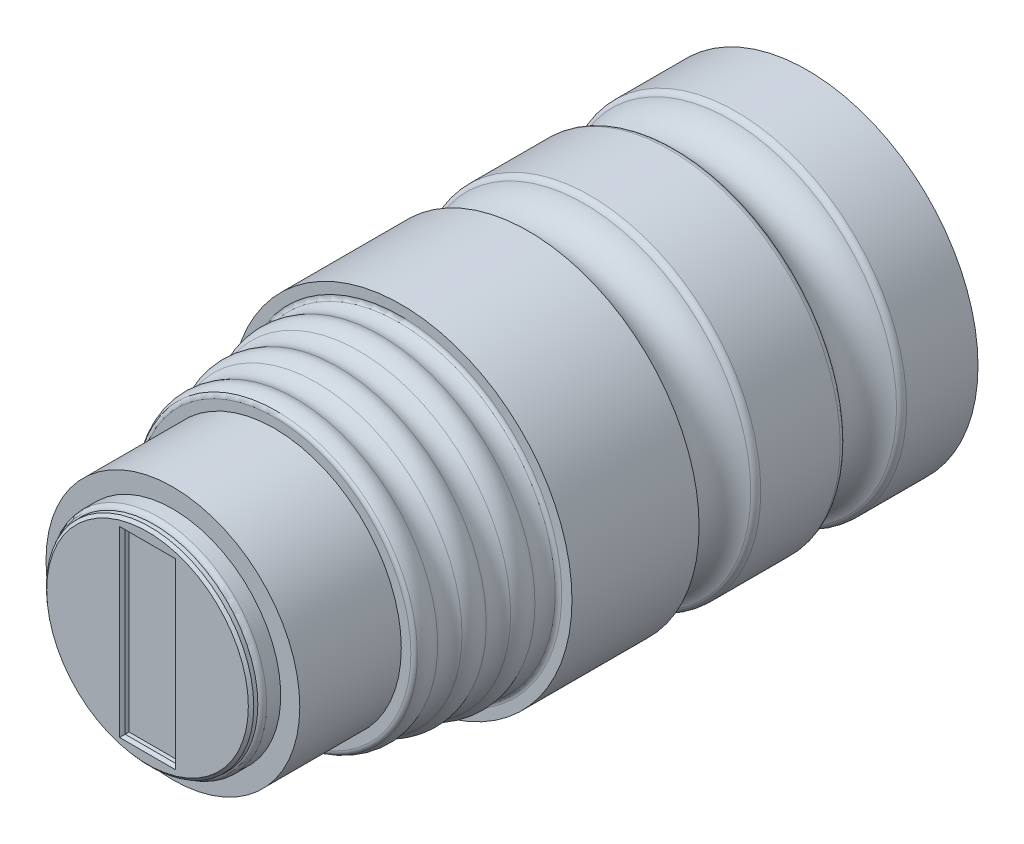
ISO-10303-21;
HEADER;
FILE_DESCRIPTION(('STEP AP214'),'2;1');
FILE_NAME('part.step','',(''),(''),'','','');
FILE_SCHEMA(('AUTOMOTIVE_DESIGN { 1 0 10303 214 1 1 1 1 }'));
ENDSEC;
DATA;
#1=APPLICATION_CONTEXT('core data for automotive mechanical design processes');
#2=APPLICATION_PROTOCOL_DEFINITION('international standard','automotive_design',2000,#1);
#3=PRODUCT_CONTEXT('',#1,'mechanical');
#4=PRODUCT('Part','Part','',(#3));
#5=PRODUCT_RELATED_PRODUCT_CATEGORY('part','',(#4));
#6=PRODUCT_DEFINITION_FORMATION('','',#4);
#7=PRODUCT_DEFINITION_CONTEXT('part definition',#1,'design');
#8=PRODUCT_DEFINITION('design','',#6,#7);
#9=PRODUCT_DEFINITION_SHAPE('','',#8);
#10=(LENGTH_UNIT() NAMED_UNIT(*) SI_UNIT(.MILLI.,.METRE.));
#11=(NAMED_UNIT(*) PLANE_ANGLE_UNIT() SI_UNIT($,.RADIAN.));
#12=(NAMED_UNIT(*) SI_UNIT($,.STERADIAN.) SOLID_ANGLE_UNIT());
#13=UNCERTAINTY_MEASURE_WITH_UNIT(LENGTH_MEASURE(1.E-05),#10,'distance_accuracy_value','');
#14=(GEOMETRIC_REPRESENTATION_CONTEXT(3) GLOBAL_UNCERTAINTY_ASSIGNED_CONTEXT((#13)) GLOBAL_UNIT_ASSIGNED_CONTEXT((#10,
#11,#12)) REPRESENTATION_CONTEXT('',''));
#15=CARTESIAN_POINT('',(0.,0.,0.));
#16=DIRECTION('',(0.,0.,1.));
#17=DIRECTION('',(1.,0.,0.));
#18=AXIS2_PLACEMENT_3D('',#15,#16,#17);
#19=CARTESIAN_POINT('',(10.95,0.,4.));
#20=DIRECTION('',(0.,0.,-1.));
#21=DIRECTION('',(-1.,0.,0.));
#22=AXIS2_PLACEMENT_3D('',#19,#20,#21);
#23=PLANE('',#22);
#24=CARTESIAN_POINT('',(0.,0.,4.));
#25=DIRECTION('',(0.,0.,-1.));
#26=DIRECTION('',(-1.,0.,0.));
#27=AXIS2_PLACEMENT_3D('',#24,#25,#26);
#28=CIRCLE('',#27,10.7534342209073);
#29=CARTESIAN_POINT('',(-10.7534342209073,0.,4.));
#30=VERTEX_POINT('',#29);
#31=EDGE_CURVE('E11',#30,#30,#28,.F.);
#32=ORIENTED_EDGE('',*,*,#31,.T.);
#33=EDGE_LOOP('',(#32));
#34=FACE_BOUND('',#33,.T.);
#35=CARTESIAN_POINT('',(0.,0.,4.));
#36=DIRECTION('',(0.,0.,-1.));
#37=DIRECTION('',(-1.,0.,0.));
#38=AXIS2_PLACEMENT_3D('',#35,#36,#37);
#39=CIRCLE('',#38,10.);
#40=CARTESIAN_POINT('',(-10.,0.,4.));
#41=VERTEX_POINT('',#40);
#42=EDGE_CURVE('E116',#41,#41,#39,.T.);
#43=ORIENTED_EDGE('',*,*,#42,.T.);
#44=EDGE_LOOP('',(#43));
#45=FACE_BOUND('',#44,.T.);
#46=ADVANCED_FACE('F39',(#34,#45),#23,.F.);
#47=CARTESIAN_POINT('',(0.,0.,2.97454517728132));
#48=DIRECTION('',(0.,0.,-1.));
#49=DIRECTION('',(-1.,0.,0.));
#50=AXIS2_PLACEMENT_3D('',#47,#48,#49);
#51=TOROIDAL_SURFACE('',#50,9.79419007076437,1.54513888888884);
#52=CARTESIAN_POINT('',(0.,0.,3.81847300053728));
#53=DIRECTION('',(0.,0.,-1.));
#54=DIRECTION('',(-1.,0.,0.));
#55=AXIS2_PLACEMENT_3D('',#52,#53,#54);
#56=CIRCLE('',#55,11.0885007039167);
#57=CARTESIAN_POINT('',(-11.0885007039167,0.,3.81847300053728));
#58=VERTEX_POINT('',#57);
#59=EDGE_CURVE('E47',#58,#58,#56,.T.);
#60=ORIENTED_EDGE('',*,*,#59,.T.);
#61=EDGE_LOOP('',(#60));
#62=FACE_BOUND('',#61,.T.);
#63=CARTESIAN_POINT('',(0.,0.,2.33333333333333));
#64=DIRECTION('',(0.,0.,-1.));
#65=DIRECTION('',(-1.,0.,0.));
#66=AXIS2_PLACEMENT_3D('',#63,#64,#65);
#67=CIRCLE('',#66,11.2);
#68=CARTESIAN_POINT('',(-11.2,0.,2.33333333333333));
#69=VERTEX_POINT('',#68);
#70=EDGE_CURVE('E270',#69,#69,#67,.T.);
#71=ORIENTED_EDGE('',*,*,#70,.F.);
#72=EDGE_LOOP('',(#71));
#73=FACE_BOUND('',#72,.T.);
#74=ADVANCED_FACE('F156',(#62,#73),#51,.T.);
#75=CARTESIAN_POINT('',(0.,0.,1.69212148938536));
#76=DIRECTION('',(0.,0.,-1.));
#77=DIRECTION('',(-1.,0.,0.));
#78=AXIS2_PLACEMENT_3D('',#75,#76,#77);
#79=TOROIDAL_SURFACE('',#78,12.6058099292357,1.54513888888891);
#80=CARTESIAN_POINT('',(0.,0.,0.66666666666667));
#81=DIRECTION('',(0.,0.,-1.));
#82=DIRECTION('',(-1.,0.,0.));
#83=AXIS2_PLACEMENT_3D('',#80,#81,#82);
#84=CIRCLE('',#83,11.45);
#85=CARTESIAN_POINT('',(-11.45,0.,0.666666666666671));
#86=VERTEX_POINT('',#85);
#87=EDGE_CURVE('E273',#86,#86,#84,.T.);
#88=ORIENTED_EDGE('',*,*,#87,.F.);
#89=EDGE_LOOP('',(#88));
#90=FACE_BOUND('',#89,.T.);
#91=ORIENTED_EDGE('',*,*,#70,.T.);
#92=EDGE_LOOP('',(#91));
#93=FACE_BOUND('',#92,.T.);
#94=ADVANCED_FACE('F174',(#90,#93),#79,.F.);
#95=CARTESIAN_POINT('',(0.,0.,-0.358788156052017));
#96=DIRECTION('',(0.,0.,-1.));
#97=DIRECTION('',(-1.,0.,0.));
#98=AXIS2_PLACEMENT_3D('',#95,#96,#97);
#99=TOROIDAL_SURFACE('',#98,10.2941900707643,1.54513888888888);
#100=CARTESIAN_POINT('',(0.,0.,-1.));
#101=DIRECTION('',(0.,0.,-1.));
#102=DIRECTION('',(-1.,0.,0.));
#103=AXIS2_PLACEMENT_3D('',#100,#101,#102);
#104=CIRCLE('',#103,11.7);
#105=CARTESIAN_POINT('',(-11.7,0.,-0.999999999999999));
#106=VERTEX_POINT('',#105);
#107=EDGE_CURVE('E331',#106,#106,#104,.T.);
#108=ORIENTED_EDGE('',*,*,#107,.F.);
#109=EDGE_LOOP('',(#108));
#110=FACE_BOUND('',#109,.T.);
#111=ORIENTED_EDGE('',*,*,#87,.T.);
#112=EDGE_LOOP('',(#111));
#113=FACE_BOUND('',#112,.T.);
#114=ADVANCED_FACE('F391',(#110,#113),#99,.T.);
#115=CARTESIAN_POINT('',(0.,0.,-1.64121184394798));
#116=DIRECTION('',(0.,0.,-1.));
#117=DIRECTION('',(-1.,0.,0.));
#118=AXIS2_PLACEMENT_3D('',#115,#116,#117);
#119=TOROIDAL_SURFACE('',#118,13.1058099292357,1.54513888888889);
#120=CARTESIAN_POINT('',(0.,0.,-2.66666666666667));
#121=DIRECTION('',(0.,0.,-1.));
#122=DIRECTION('',(-1.,0.,0.));
#123=AXIS2_PLACEMENT_3D('',#120,#121,#122);
#124=CIRCLE('',#123,11.95);
#125=CARTESIAN_POINT('',(-11.95,0.,-2.66666666666667));
#126=VERTEX_POINT('',#125);
#127=EDGE_CURVE('E334',#126,#126,#124,.T.);
#128=ORIENTED_EDGE('',*,*,#127,.F.);
#129=EDGE_LOOP('',(#128));
#130=FACE_BOUND('',#129,.T.);
#131=ORIENTED_EDGE('',*,*,#107,.T.);
#132=EDGE_LOOP('',(#131));
#133=FACE_BOUND('',#132,.T.);
#134=ADVANCED_FACE('F387',(#130,#133),#119,.F.);
#135=CARTESIAN_POINT('',(0.,0.,-3.69212148938535));
#136=DIRECTION('',(0.,0.,-1.));
#137=DIRECTION('',(-1.,0.,0.));
#138=AXIS2_PLACEMENT_3D('',#135,#136,#137);
#139=TOROIDAL_SURFACE('',#138,10.7941900707643,1.54513888888888);
#140=CARTESIAN_POINT('',(0.,0.,-4.33333333333333));
#141=DIRECTION('',(0.,0.,-1.));
#142=DIRECTION('',(-1.,0.,0.));
#143=AXIS2_PLACEMENT_3D('',#140,#141,#142);
#144=CIRCLE('',#143,12.2);
#145=CARTESIAN_POINT('',(-12.2,0.,-4.33333333333333));
#146=VERTEX_POINT('',#145);
#147=EDGE_CURVE('E337',#146,#146,#144,.T.);
#148=ORIENTED_EDGE('',*,*,#147,.F.);
#149=EDGE_LOOP('',(#148));
#150=FACE_BOUND('',#149,.T.);
#151=ORIENTED_EDGE('',*,*,#127,.T.);
#152=EDGE_LOOP('',(#151));
#153=FACE_BOUND('',#152,.T.);
#154=ADVANCED_FACE('F383',(#150,#153),#139,.T.);
#155=CARTESIAN_POINT('',(0.,0.,-4.97454517728132));
#156=DIRECTION('',(0.,0.,-1.));
#157=DIRECTION('',(-1.,0.,0.));
#158=AXIS2_PLACEMENT_3D('',#155,#156,#157);
#159=TOROIDAL_SURFACE('',#158,13.6058099292357,1.54513888888889);
#160=CARTESIAN_POINT('',(0.,0.,-5.81847300053727));
#161=DIRECTION('',(0.,0.,1.));
#162=DIRECTION('',(1.,0.,0.));
#163=AXIS2_PLACEMENT_3D('',#160,#161,#162);
#164=CIRCLE('',#163,12.3114992960833);
#165=CARTESIAN_POINT('',(12.3114992960833,0.,-5.81847300053727));
#166=VERTEX_POINT('',#165);
#167=EDGE_CURVE('E151',#166,#166,#164,.T.);
#168=ORIENTED_EDGE('',*,*,#167,.T.);
#169=EDGE_LOOP('',(#168));
#170=FACE_BOUND('',#169,.T.);
#171=ORIENTED_EDGE('',*,*,#147,.T.);
#172=EDGE_LOOP('',(#171));
#173=FACE_BOUND('',#172,.T.);
#174=ADVANCED_FACE('F379',(#170,#173),#159,.F.);
#175=CARTESIAN_POINT('',(12.45,0.,-6.));
#176=DIRECTION('',(0.,0.,-1.));
#177=DIRECTION('',(-1.,0.,0.));
#178=AXIS2_PLACEMENT_3D('',#175,#176,#177);
#179=PLANE('',#178);
#180=CARTESIAN_POINT('',(0.,0.,-6.));
#181=DIRECTION('',(0.,0.,-1.));
#182=DIRECTION('',(-1.,0.,0.));
#183=AXIS2_PLACEMENT_3D('',#180,#181,#182);
#184=CIRCLE('',#183,12.6465657790926);
#185=CARTESIAN_POINT('',(-12.6465657790926,0.,-6.));
#186=VERTEX_POINT('',#185);
#187=EDGE_CURVE('E148',#186,#186,#184,.T.);
#188=ORIENTED_EDGE('',*,*,#187,.T.);
#189=EDGE_LOOP('',(#188));
#190=FACE_BOUND('',#189,.T.);
#191=CARTESIAN_POINT('',(0.,0.,-6.));
#192=DIRECTION('',(0.,0.,-1.));
#193=DIRECTION('',(-1.,0.,0.));
#194=AXIS2_PLACEMENT_3D('',#191,#192,#193);
#195=CIRCLE('',#194,13.45);
#196=CARTESIAN_POINT('',(-13.45,0.,-6.));
#197=VERTEX_POINT('',#196);
#198=EDGE_CURVE('E340',#197,#197,#195,.T.);
#199=ORIENTED_EDGE('',*,*,#198,.F.);
#200=EDGE_LOOP('',(#199));
#201=FACE_BOUND('',#200,.T.);
#202=ADVANCED_FACE('F375',(#190,#201),#179,.F.);
#203=CARTESIAN_POINT('',(0.,0.,-38.));
#204=DIRECTION('',(0.,0.,-1.));
#205=DIRECTION('',(-1.,0.,0.));
#206=AXIS2_PLACEMENT_3D('',#203,#204,#205);
#207=CYLINDRICAL_SURFACE('',#206,13.45);
#208=CARTESIAN_POINT('',(0.,0.,-16.0200222717426));
#209=DIRECTION('',(0.,0.,-1.));
#210=DIRECTION('',(-1.,0.,0.));
#211=AXIS2_PLACEMENT_3D('',#208,#209,#210);
#212=CIRCLE('',#211,13.45);
#213=CARTESIAN_POINT('',(-13.45,0.,-16.0200222717426));
#214=VERTEX_POINT('',#213);
#215=EDGE_CURVE('E343',#214,#214,#212,.T.);
#216=ORIENTED_EDGE('',*,*,#215,.F.);
#217=EDGE_LOOP('',(#216));
#218=FACE_BOUND('',#217,.T.);
#219=ORIENTED_EDGE('',*,*,#198,.T.);
#220=EDGE_LOOP('',(#219));
#221=FACE_BOUND('',#220,.T.);
#222=ADVANCED_FACE('F371',(#218,#221),#207,.T.);
#223=CARTESIAN_POINT('',(0.,0.,-18.2650167038069));
#224=DIRECTION('',(0.,0.,-1.));
#225=DIRECTION('',(-1.,0.,0.));
#226=AXIS2_PLACEMENT_3D('',#223,#224,#225);
#227=TOROIDAL_SURFACE('',#226,13.95,2.3);
#228=CARTESIAN_POINT('',(0.,0.,-20.4133311831234));
#229=DIRECTION('',(0.,0.,1.));
#230=DIRECTION('',(1.,0.,0.));
#231=AXIS2_PLACEMENT_3D('',#228,#229,#230);
#232=CIRCLE('',#231,13.1285714285714);
#233=CARTESIAN_POINT('',(13.1285714285714,0.,-20.4133311831234));
#234=VERTEX_POINT('',#233);
#235=EDGE_CURVE('E133',#234,#234,#232,.T.);
#236=ORIENTED_EDGE('',*,*,#235,.T.);
#237=EDGE_LOOP('',(#236));
#238=FACE_BOUND('',#237,.T.);
#239=ORIENTED_EDGE('',*,*,#215,.T.);
#240=EDGE_LOOP('',(#239));
#241=FACE_BOUND('',#240,.T.);
#242=ADVANCED_FACE('F367',(#238,#241),#227,.F.);
#243=CARTESIAN_POINT('',(0.,0.,-38.));
#244=DIRECTION('',(0.,0.,-1.));
#245=DIRECTION('',(-1.,0.,0.));
#246=AXIS2_PLACEMENT_3D('',#243,#244,#245);
#247=CYLINDRICAL_SURFACE('',#246,13.45);
#248=CARTESIAN_POINT('',(0.,0.,-20.8803560699313));
#249=DIRECTION('',(0.,0.,1.));
#250=DIRECTION('',(1.,0.,0.));
#251=AXIS2_PLACEMENT_3D('',#248,#249,#250);
#252=CIRCLE('',#251,13.45);
#253=CARTESIAN_POINT('',(13.45,0.,-20.8803560699313));
#254=VERTEX_POINT('',#253);
#255=EDGE_CURVE('E130',#254,#254,#252,.F.);
#256=ORIENTED_EDGE('',*,*,#255,.T.);
#257=EDGE_LOOP('',(#256));
#258=FACE_BOUND('',#257,.T.);
#259=CARTESIAN_POINT('',(0.,0.,-27.1396662018112));
#260=DIRECTION('',(0.,0.,1.));
#261=DIRECTION('',(1.,0.,0.));
#262=AXIS2_PLACEMENT_3D('',#259,#260,#261);
#263=CIRCLE('',#262,13.45);
#264=CARTESIAN_POINT('',(13.45,0.,-27.1396662018112));
#265=VERTEX_POINT('',#264);
#266=EDGE_CURVE('E127',#265,#265,#263,.T.);
#267=ORIENTED_EDGE('',*,*,#266,.T.);
#268=EDGE_LOOP('',(#267));
#269=FACE_BOUND('',#268,.T.);
#270=ADVANCED_FACE('F361',(#258,#269),#247,.T.);
#271=CARTESIAN_POINT('',(0.,0.,-29.7550055679356));
#272=DIRECTION('',(0.,0.,-1.));
#273=DIRECTION('',(-1.,0.,0.));
#274=AXIS2_PLACEMENT_3D('',#271,#272,#273);
#275=TOROIDAL_SURFACE('',#274,13.95,2.3);
#276=CARTESIAN_POINT('',(0.,0.,-27.6066910886192));
#277=DIRECTION('',(0.,0.,-1.));
#278=DIRECTION('',(-1.,0.,0.));
#279=AXIS2_PLACEMENT_3D('',#276,#277,#278);
#280=CIRCLE('',#279,13.1285714285715);
#281=CARTESIAN_POINT('',(-13.1285714285715,0.,-27.6066910886192));
#282=VERTEX_POINT('',#281);
#283=EDGE_CURVE('E139',#282,#282,#280,.T.);
#284=ORIENTED_EDGE('',*,*,#283,.T.);
#285=EDGE_LOOP('',(#284));
#286=FACE_BOUND('',#285,.T.);
#287=CARTESIAN_POINT('',(0.,0.,-31.9033200472521));
#288=DIRECTION('',(0.,0.,1.));
#289=DIRECTION('',(1.,0.,0.));
#290=AXIS2_PLACEMENT_3D('',#287,#288,#289);
#291=CIRCLE('',#290,13.1285714285714);
#292=CARTESIAN_POINT('',(13.1285714285714,0.,-31.9033200472521));
#293=VERTEX_POINT('',#292);
#294=EDGE_CURVE('E136',#293,#293,#291,.T.);
#295=ORIENTED_EDGE('',*,*,#294,.T.);
#296=EDGE_LOOP('',(#295));
#297=FACE_BOUND('',#296,.T.);
#298=ADVANCED_FACE('F353',(#286,#297),#275,.F.);
#299=CARTESIAN_POINT('',(0.,0.,-38.));
#300=DIRECTION('',(0.,0.,-1.));
#301=DIRECTION('',(-1.,0.,0.));
#302=AXIS2_PLACEMENT_3D('',#299,#300,#301);
#303=CYLINDRICAL_SURFACE('',#302,13.45);
#304=CARTESIAN_POINT('',(0.,0.,-32.37034493406));
#305=DIRECTION('',(0.,0.,1.));
#306=DIRECTION('',(1.,0.,0.));
#307=AXIS2_PLACEMENT_3D('',#304,#305,#306);
#308=CIRCLE('',#307,13.45);
#309=CARTESIAN_POINT('',(13.45,0.,-32.37034493406));
#310=VERTEX_POINT('',#309);
#311=EDGE_CURVE('E142',#310,#310,#308,.F.);
#312=ORIENTED_EDGE('',*,*,#311,.T.);
#313=EDGE_LOOP('',(#312));
#314=FACE_BOUND('',#313,.T.);
#315=CARTESIAN_POINT('',(0.,0.,-38.));
#316=DIRECTION('',(0.,0.,-1.));
#317=DIRECTION('',(-1.,0.,0.));
#318=AXIS2_PLACEMENT_3D('',#315,#316,#317);
#319=CIRCLE('',#318,13.45);
#320=CARTESIAN_POINT('',(-13.45,0.,-38.));
#321=VERTEX_POINT('',#320);
#322=EDGE_CURVE('E346',#321,#321,#319,.T.);
#323=ORIENTED_EDGE('',*,*,#322,.F.);
#324=EDGE_LOOP('',(#323));
#325=FACE_BOUND('',#324,.T.);
#326=ADVANCED_FACE('F351',(#314,#325),#303,.T.);
#327=CARTESIAN_POINT('',(13.45,0.,-38.));
#328=DIRECTION('',(0.,0.,1.));
#329=DIRECTION('',(1.,0.,0.));
#330=AXIS2_PLACEMENT_3D('',#327,#328,#329);
#331=PLANE('',#330);
#332=ORIENTED_EDGE('',*,*,#322,.T.);
#333=EDGE_LOOP('',(#332));
#334=FACE_BOUND('',#333,.T.);
#335=ADVANCED_FACE('F211',(#334),#331,.F.);
#336=CARTESIAN_POINT('',(0.,0.,12.));
#337=DIRECTION('',(0.,0.,1.));
#338=DIRECTION('',(1.,0.,0.));
#339=AXIS2_PLACEMENT_3D('',#336,#337,#338);
#340=PLANE('',#339);
#341=CARTESIAN_POINT('',(0.,0.,12.));
#342=DIRECTION('',(0.,0.,1.));
#343=DIRECTION('',(1.,0.,0.));
#344=AXIS2_PLACEMENT_3D('',#341,#342,#343);
#345=CIRCLE('',#344,10.);
#346=CARTESIAN_POINT('',(10.,0.,12.));
#347=VERTEX_POINT('',#346);
#348=EDGE_CURVE('E282',#347,#347,#345,.T.);
#349=ORIENTED_EDGE('',*,*,#348,.T.);
#350=EDGE_LOOP('',(#349));
#351=FACE_BOUND('',#350,.T.);
#352=CARTESIAN_POINT('',(0.,0.,12.));
#353=DIRECTION('',(0.,0.,-1.));
#354=DIRECTION('',(-1.,0.,0.));
#355=AXIS2_PLACEMENT_3D('',#352,#353,#354);
#356=CIRCLE('',#355,8.5);
#357=CARTESIAN_POINT('',(-8.49999999999999,0.,12.));
#358=VERTEX_POINT('',#357);
#359=EDGE_CURVE('E109',#358,#358,#356,.T.);
#360=ORIENTED_EDGE('',*,*,#359,.T.);
#361=EDGE_LOOP('',(#360));
#362=FACE_BOUND('',#361,.T.);
#363=ADVANCED_FACE('F208',(#351,#362),#340,.T.);
#364=CARTESIAN_POINT('',(0.,0.,12.));
#365=DIRECTION('',(0.,0.,-1.));
#366=DIRECTION('',(-1.,0.,0.));
#367=AXIS2_PLACEMENT_3D('',#364,#365,#366);
#368=CYLINDRICAL_SURFACE('',#367,10.);
#369=ORIENTED_EDGE('',*,*,#348,.F.);
#370=EDGE_LOOP('',(#369));
#371=FACE_BOUND('',#370,.T.);
#372=ORIENTED_EDGE('',*,*,#42,.F.);
#373=EDGE_LOOP('',(#372));
#374=FACE_BOUND('',#373,.T.);
#375=ADVANCED_FACE('F183',(#371,#374),#368,.T.);
#376=CARTESIAN_POINT('',(0.,0.,-38.));
#377=DIRECTION('',(0.,0.,-1.));
#378=DIRECTION('',(-1.,0.,0.));
#379=AXIS2_PLACEMENT_3D('',#376,#377,#378);
#380=CYLINDRICAL_SURFACE('',#379,8.5);
#381=CARTESIAN_POINT('',(0.,0.,13.111651734006));
#382=DIRECTION('',(0.,0.,1.));
#383=DIRECTION('',(1.,0.,0.));
#384=AXIS2_PLACEMENT_3D('',#381,#382,#383);
#385=CIRCLE('',#384,8.5);
#386=CARTESIAN_POINT('',(8.5,0.,13.111651734006));
#387=VERTEX_POINT('',#386);
#388=EDGE_CURVE('E145',#387,#387,#385,.F.);
#389=ORIENTED_EDGE('',*,*,#388,.T.);
#390=EDGE_LOOP('',(#389));
#391=FACE_BOUND('',#390,.T.);
#392=ORIENTED_EDGE('',*,*,#359,.F.);
#393=EDGE_LOOP('',(#392));
#394=FACE_BOUND('',#393,.T.);
#395=ADVANCED_FACE('F179',(#391,#394),#380,.T.);
#396=CARTESIAN_POINT('',(0.,0.,14.));
#397=DIRECTION('',(0.,0.,-1.));
#398=DIRECTION('',(-1.,0.,0.));
#399=AXIS2_PLACEMENT_3D('',#396,#397,#398);
#400=CONICAL_SURFACE('',#399,7.94531631790703,0.85521133347721);
#401=CARTESIAN_POINT('',(0.,0.,13.800487189948));
#402=DIRECTION('',(0.,0.,-1.));
#403=DIRECTION('',(-1.,0.,0.));
#404=AXIS2_PLACEMENT_3D('',#401,#402,#403);
#405=CIRCLE('',#404,8.1748295514267);
#406=CARTESIAN_POINT('',(-8.1748295514267,0.,13.800487189948));
#407=VERTEX_POINT('',#406);
#408=EDGE_CURVE('E113',#407,#407,#405,.T.);
#409=ORIENTED_EDGE('',*,*,#408,.F.);
#410=EDGE_LOOP('',(#409));
#411=FACE_BOUND('',#410,.T.);
#412=CARTESIAN_POINT('',(0.,0.,14.));
#413=DIRECTION('',(0.,0.,1.));
#414=DIRECTION('',(1.,0.,0.));
#415=AXIS2_PLACEMENT_3D('',#412,#413,#414);
#416=CIRCLE('',#415,7.94531631790703);
#417=CARTESIAN_POINT('',(7.94531631790703,0.,14.));
#418=VERTEX_POINT('',#417);
#419=EDGE_CURVE('E288',#418,#418,#416,.T.);
#420=ORIENTED_EDGE('',*,*,#419,.F.);
#421=EDGE_LOOP('',(#420));
#422=FACE_BOUND('',#421,.T.);
#423=ADVANCED_FACE('F182',(#411,#422),#400,.T.);
#424=CARTESIAN_POINT('',(0.,0.,2.));
#425=DIRECTION('',(0.,0.,-1.));
#426=DIRECTION('',(1.,0.,0.));
#427=AXIS2_PLACEMENT_3D('',#424,#425,#426);
#428=CONICAL_SURFACE('',#427,9.,0.0698131700797733);
#429=ORIENTED_EDGE('',*,*,#408,.T.);
#430=EDGE_LOOP('',(#429));
#431=FACE_BOUND('',#430,.T.);
#432=CARTESIAN_POINT('',(0.,0.,13.5));
#433=DIRECTION('',(0.,0.,-1.));
#434=DIRECTION('',(-1.,0.,0.));
#435=AXIS2_PLACEMENT_3D('',#432,#433,#434);
#436=CIRCLE('',#435,8.19584166264963);
#437=CARTESIAN_POINT('',(-8.19584166264963,0.,13.5));
#438=VERTEX_POINT('',#437);
#439=EDGE_CURVE('E112',#438,#438,#436,.T.);
#440=ORIENTED_EDGE('',*,*,#439,.F.);
#441=EDGE_LOOP('',(#440));
#442=FACE_BOUND('',#441,.T.);
#443=ADVANCED_FACE('F203',(#431,#442),#428,.T.);
#444=CARTESIAN_POINT('',(0.,0.,14.));
#445=DIRECTION('',(0.,0.,1.));
#446=DIRECTION('',(1.,0.,0.));
#447=AXIS2_PLACEMENT_3D('',#444,#445,#446);
#448=PLANE('',#447);
#449=DIRECTION('',(0.,-1.,0.));
#450=VECTOR('',#449,1.);
#451=CARTESIAN_POINT('',(2.19999999999999,-7.,14.));
#452=LINE('',#451,#450);
#453=CARTESIAN_POINT('',(2.19999999999999,7.19999999999999,14.));
#454=VERTEX_POINT('',#453);
#455=CARTESIAN_POINT('',(2.19999999999999,-7.19999999999999,14.));
#456=VERTEX_POINT('',#455);
#457=EDGE_CURVE('E291',#454,#456,#452,.T.);
#458=ORIENTED_EDGE('',*,*,#457,.T.);
#459=DIRECTION('',(-1.,0.,0.));
#460=VECTOR('',#459,1.);
#461=CARTESIAN_POINT('',(-2.,-7.19999999999999,14.));
#462=LINE('',#461,#460);
#463=CARTESIAN_POINT('',(-2.19999999999999,-7.19999999999999,14.));
#464=VERTEX_POINT('',#463);
#465=EDGE_CURVE('E297',#456,#464,#462,.T.);
#466=ORIENTED_EDGE('',*,*,#465,.T.);
#467=DIRECTION('',(0.,1.,0.));
#468=VECTOR('',#467,1.);
#469=CARTESIAN_POINT('',(-2.19999999999999,7.,14.));
#470=LINE('',#469,#468);
#471=CARTESIAN_POINT('',(-2.19999999999999,7.19999999999999,14.));
#472=VERTEX_POINT('',#471);
#473=EDGE_CURVE('E295',#464,#472,#470,.T.);
#474=ORIENTED_EDGE('',*,*,#473,.T.);
#475=DIRECTION('',(1.,0.,0.));
#476=VECTOR('',#475,1.);
#477=CARTESIAN_POINT('',(2.,7.19999999999999,14.));
#478=LINE('',#477,#476);
#479=EDGE_CURVE('E293',#472,#454,#478,.T.);
#480=ORIENTED_EDGE('',*,*,#479,.T.);
#481=EDGE_LOOP('',(#458,#466,#474,#480));
#482=FACE_BOUND('',#481,.T.);
#483=ORIENTED_EDGE('',*,*,#419,.T.);
#484=EDGE_LOOP('',(#483));
#485=FACE_BOUND('',#484,.T.);
#486=ADVANCED_FACE('F199',(#482,#485),#448,.T.);
#487=CARTESIAN_POINT('',(-1.98082464074058,7.,13.7808246407406));
#488=DIRECTION('',(0.707106781186548,0.,0.707106781186547));
#489=DIRECTION('',(0.,1.,0.));
#490=AXIS2_PLACEMENT_3D('',#487,#488,#489);
#491=PLANE('',#490);
#492=DIRECTION('',(0.577350269189624,-0.577350269189628,-0.577350269189625));
#493=VECTOR('',#492,1.);
#494=CARTESIAN_POINT('',(-1.98721642716039,6.98721642716039,13.7872164271604));
#495=LINE('',#494,#493);
#496=CARTESIAN_POINT('',(-1.98082464074058,6.98082464074058,13.7808246407406));
#497=VERTEX_POINT('',#496);
#498=EDGE_CURVE('E123',#497,#472,#495,.F.);
#499=ORIENTED_EDGE('',*,*,#498,.T.);
#500=ORIENTED_EDGE('',*,*,#473,.F.);
#501=DIRECTION('',(0.577350269189624,0.577350269189628,-0.577350269189625));
#502=VECTOR('',#501,1.);
#503=CARTESIAN_POINT('',(-1.98721642716039,-6.98721642716039,13.7872164271604));
#504=LINE('',#503,#502);
#505=CARTESIAN_POINT('',(-1.98082464074058,-6.98082464074058,13.7808246407406));
#506=VERTEX_POINT('',#505);
#507=EDGE_CURVE('E308',#506,#464,#504,.F.);
#508=ORIENTED_EDGE('',*,*,#507,.F.);
#509=DIRECTION('',(0.,-1.,0.));
#510=VECTOR('',#509,1.);
#511=CARTESIAN_POINT('',(-1.98082464074058,-7.,13.7808246407406));
#512=LINE('',#511,#510);
#513=EDGE_CURVE('E300',#497,#506,#512,.T.);
#514=ORIENTED_EDGE('',*,*,#513,.F.);
#515=EDGE_LOOP('',(#499,#500,#508,#514));
#516=FACE_BOUND('',#515,.T.);
#517=ADVANCED_FACE('F202',(#516),#491,.T.);
#518=CARTESIAN_POINT('',(-2.,6.98082464074058,13.7808246407406));
#519=DIRECTION('',(0.,-0.707106781186546,0.707106781186549));
#520=DIRECTION('',(1.,0.,0.));
#521=AXIS2_PLACEMENT_3D('',#518,#519,#520);
#522=PLANE('',#521);
#523=DIRECTION('',(-0.577350269189624,-0.577350269189628,-0.577350269189625));
#524=VECTOR('',#523,1.);
#525=CARTESIAN_POINT('',(0.65388309382706,5.65388309382705,12.4538830938271));
#526=LINE('',#525,#524);
#527=CARTESIAN_POINT('',(1.98082464074058,6.98082464074058,13.7808246407406));
#528=VERTEX_POINT('',#527);
#529=EDGE_CURVE('E309',#454,#528,#526,.T.);
#530=ORIENTED_EDGE('',*,*,#529,.F.);
#531=ORIENTED_EDGE('',*,*,#479,.F.);
#532=ORIENTED_EDGE('',*,*,#498,.F.);
#533=DIRECTION('',(-1.,0.,0.));
#534=VECTOR('',#533,1.);
#535=CARTESIAN_POINT('',(-2.,6.98082464074058,13.7808246407406));
#536=LINE('',#535,#534);
#537=EDGE_CURVE('E303',#528,#497,#536,.T.);
#538=ORIENTED_EDGE('',*,*,#537,.F.);
#539=EDGE_LOOP('',(#530,#531,#532,#538));
#540=FACE_BOUND('',#539,.T.);
#541=ADVANCED_FACE('F230',(#540),#522,.T.);
#542=CARTESIAN_POINT('',(1.98082464074058,7.,13.7808246407406));
#543=DIRECTION('',(-0.707106781186548,0.,0.707106781186547));
#544=DIRECTION('',(0.,-1.,0.));
#545=AXIS2_PLACEMENT_3D('',#542,#543,#544);
#546=PLANE('',#545);
#547=ORIENTED_EDGE('',*,*,#529,.T.);
#548=DIRECTION('',(0.,1.,0.));
#549=VECTOR('',#548,1.);
#550=CARTESIAN_POINT('',(1.98082464074058,7.,13.7808246407406));
#551=LINE('',#550,#549);
#552=CARTESIAN_POINT('',(1.98082464074058,-6.98082464074058,13.7808246407406));
#553=VERTEX_POINT('',#552);
#554=EDGE_CURVE('E119',#553,#528,#551,.T.);
#555=ORIENTED_EDGE('',*,*,#554,.F.);
#556=DIRECTION('',(0.577350269189624,-0.577350269189628,0.577350269189625));
#557=VECTOR('',#556,1.);
#558=CARTESIAN_POINT('',(0.65388309382706,-5.65388309382705,12.4538830938271));
#559=LINE('',#558,#557);
#560=EDGE_CURVE('E278',#456,#553,#559,.F.);
#561=ORIENTED_EDGE('',*,*,#560,.F.);
#562=ORIENTED_EDGE('',*,*,#457,.F.);
#563=EDGE_LOOP('',(#547,#555,#561,#562));
#564=FACE_BOUND('',#563,.T.);
#565=ADVANCED_FACE('F223',(#564),#546,.T.);
#566=CARTESIAN_POINT('',(-2.,-6.98082464074058,13.7808246407406));
#567=DIRECTION('',(0.,0.707106781186546,0.707106781186549));
#568=DIRECTION('',(-1.,0.,0.));
#569=AXIS2_PLACEMENT_3D('',#566,#567,#568);
#570=PLANE('',#569);
#571=ORIENTED_EDGE('',*,*,#507,.T.);
#572=ORIENTED_EDGE('',*,*,#465,.F.);
#573=ORIENTED_EDGE('',*,*,#560,.T.);
#574=DIRECTION('',(1.,0.,0.));
#575=VECTOR('',#574,1.);
#576=CARTESIAN_POINT('',(2.,-6.98082464074058,13.7808246407406));
#577=LINE('',#576,#575);
#578=EDGE_CURVE('E98',#506,#553,#577,.T.);
#579=ORIENTED_EDGE('',*,*,#578,.F.);
#580=EDGE_LOOP('',(#571,#572,#573,#579));
#581=FACE_BOUND('',#580,.T.);
#582=ADVANCED_FACE('F194',(#581),#570,.T.);
#583=CARTESIAN_POINT('',(-2.,-7.,14.));
#584=DIRECTION('',(0.,-0.996194698091746,-0.0871557427476584));
#585=DIRECTION('',(0.,0.0871557427476584,-0.996194698091746));
#586=AXIS2_PLACEMENT_3D('',#583,#584,#585);
#587=PLANE('',#586);
#588=DIRECTION('',(1.,0.,0.));
#589=VECTOR('',#588,1.);
#590=CARTESIAN_POINT('',(-2.,-6.95625566823704,13.5));
#591=LINE('',#590,#589);
#592=CARTESIAN_POINT('',(-1.95625566823704,-6.95625566823704,13.5));
#593=VERTEX_POINT('',#592);
#594=CARTESIAN_POINT('',(1.95625566823704,-6.95625566823704,13.5));
#595=VERTEX_POINT('',#594);
#596=EDGE_CURVE('E96',#593,#595,#591,.T.);
#597=ORIENTED_EDGE('',*,*,#596,.F.);
#598=DIRECTION('',(-0.0868265938642478,-0.0868265938642478,0.992432509138967));
#599=VECTOR('',#598,1.);
#600=CARTESIAN_POINT('',(-1.89445599637106,-6.89445599637106,12.7936265182784));
#601=LINE('',#600,#599);
#602=EDGE_CURVE('E103',#593,#506,#601,.T.);
#603=ORIENTED_EDGE('',*,*,#602,.T.);
#604=ORIENTED_EDGE('',*,*,#578,.T.);
#605=DIRECTION('',(0.0868265938642478,-0.0868265938642478,0.992432509138967));
#606=VECTOR('',#605,1.);
#607=CARTESIAN_POINT('',(1.96984457039173,-6.96984457039173,13.6553218623653));
#608=LINE('',#607,#606);
#609=EDGE_CURVE('E92',#595,#553,#608,.T.);
#610=ORIENTED_EDGE('',*,*,#609,.F.);
#611=EDGE_LOOP('',(#597,#603,#604,#610));
#612=FACE_BOUND('',#611,.T.);
#613=ADVANCED_FACE('F94',(#612),#587,.F.);
#614=CARTESIAN_POINT('',(2.,7.,14.));
#615=DIRECTION('',(0.996194698091746,0.,-0.0871557427476584));
#616=DIRECTION('',(-0.0871557427476584,0.,-0.996194698091746));
#617=AXIS2_PLACEMENT_3D('',#614,#615,#616);
#618=PLANE('',#617);
#619=DIRECTION('',(0.,1.,0.));
#620=VECTOR('',#619,1.);
#621=CARTESIAN_POINT('',(1.95625566823704,7.,13.5));
#622=LINE('',#621,#620);
#623=CARTESIAN_POINT('',(1.95625566823704,6.95625566823704,13.5));
#624=VERTEX_POINT('',#623);
#625=EDGE_CURVE('E106',#595,#624,#622,.T.);
#626=ORIENTED_EDGE('',*,*,#625,.F.);
#627=ORIENTED_EDGE('',*,*,#609,.T.);
#628=ORIENTED_EDGE('',*,*,#554,.T.);
#629=DIRECTION('',(0.0868265938642478,0.0868265938642478,0.992432509138967));
#630=VECTOR('',#629,1.);
#631=CARTESIAN_POINT('',(2.,7.,14.));
#632=LINE('',#631,#630);
#633=EDGE_CURVE('E102',#624,#528,#632,.T.);
#634=ORIENTED_EDGE('',*,*,#633,.F.);
#635=EDGE_LOOP('',(#626,#627,#628,#634));
#636=FACE_BOUND('',#635,.T.);
#637=ADVANCED_FACE('F107',(#636),#618,.F.);
#638=CARTESIAN_POINT('',(-2.,7.,14.));
#639=DIRECTION('',(0.,0.996194698091746,-0.0871557427476584));
#640=DIRECTION('',(0.,0.0871557427476584,0.996194698091746));
#641=AXIS2_PLACEMENT_3D('',#638,#639,#640);
#642=PLANE('',#641);
#643=DIRECTION('',(-1.,0.,0.));
#644=VECTOR('',#643,1.);
#645=CARTESIAN_POINT('',(-2.,6.95625566823704,13.5));
#646=LINE('',#645,#644);
#647=CARTESIAN_POINT('',(-1.95625566823704,6.95625566823704,13.5));
#648=VERTEX_POINT('',#647);
#649=EDGE_CURVE('E61',#624,#648,#646,.T.);
#650=ORIENTED_EDGE('',*,*,#649,.F.);
#651=ORIENTED_EDGE('',*,*,#633,.T.);
#652=ORIENTED_EDGE('',*,*,#537,.T.);
#653=DIRECTION('',(-0.0868265938642478,0.0868265938642478,0.992432509138967));
#654=VECTOR('',#653,1.);
#655=CARTESIAN_POINT('',(-2.,7.,14.));
#656=LINE('',#655,#654);
#657=EDGE_CURVE('E280',#648,#497,#656,.T.);
#658=ORIENTED_EDGE('',*,*,#657,.F.);
#659=EDGE_LOOP('',(#650,#651,#652,#658));
#660=FACE_BOUND('',#659,.T.);
#661=ADVANCED_FACE('F191',(#660),#642,.F.);
#662=CARTESIAN_POINT('',(-2.,7.,14.));
#663=DIRECTION('',(-0.996194698091746,0.,-0.0871557427476584));
#664=DIRECTION('',(-0.0871557427476584,0.,0.996194698091746));
#665=AXIS2_PLACEMENT_3D('',#662,#663,#664);
#666=PLANE('',#665);
#667=DIRECTION('',(0.,-1.,0.));
#668=VECTOR('',#667,1.);
#669=CARTESIAN_POINT('',(-1.95625566823704,7.,13.5));
#670=LINE('',#669,#668);
#671=EDGE_CURVE('E54',#648,#593,#670,.T.);
#672=ORIENTED_EDGE('',*,*,#671,.F.);
#673=ORIENTED_EDGE('',*,*,#657,.T.);
#674=ORIENTED_EDGE('',*,*,#513,.T.);
#675=ORIENTED_EDGE('',*,*,#602,.F.);
#676=EDGE_LOOP('',(#672,#673,#674,#675));
#677=FACE_BOUND('',#676,.T.);
#678=ADVANCED_FACE('F188',(#677),#666,.F.);
#679=CARTESIAN_POINT('',(8.5,0.,13.5));
#680=DIRECTION('',(0.,0.,-1.));
#681=DIRECTION('',(-1.,0.,0.));
#682=AXIS2_PLACEMENT_3D('',#679,#680,#681);
#683=PLANE('',#682);
#684=ORIENTED_EDGE('',*,*,#649,.T.);
#685=ORIENTED_EDGE('',*,*,#671,.T.);
#686=ORIENTED_EDGE('',*,*,#596,.T.);
#687=ORIENTED_EDGE('',*,*,#625,.T.);
#688=EDGE_LOOP('',(#684,#685,#686,#687));
#689=FACE_BOUND('',#688,.T.);
#690=ADVANCED_FACE('F111',(#689),#683,.F.);
#691=CARTESIAN_POINT('',(0.,0.,-20.8803560699313));
#692=DIRECTION('',(0.,0.,1.));
#693=DIRECTION('',(1.,0.,0.));
#694=AXIS2_PLACEMENT_3D('',#691,#692,#693);
#695=TOROIDAL_SURFACE('',#694,12.95,0.5);
#696=ORIENTED_EDGE('',*,*,#235,.F.);
#697=EDGE_LOOP('',(#696));
#698=FACE_BOUND('',#697,.T.);
#699=ORIENTED_EDGE('',*,*,#255,.F.);
#700=EDGE_LOOP('',(#699));
#701=FACE_BOUND('',#700,.T.);
#702=ADVANCED_FACE('F187',(#698,#701),#695,.T.);
#703=CARTESIAN_POINT('',(0.,0.,-27.1396662018112));
#704=DIRECTION('',(0.,0.,1.));
#705=DIRECTION('',(1.,0.,0.));
#706=AXIS2_PLACEMENT_3D('',#703,#704,#705);
#707=TOROIDAL_SURFACE('',#706,12.95,0.5);
#708=ORIENTED_EDGE('',*,*,#266,.F.);
#709=EDGE_LOOP('',(#708));
#710=FACE_BOUND('',#709,.T.);
#711=ORIENTED_EDGE('',*,*,#283,.F.);
#712=EDGE_LOOP('',(#711));
#713=FACE_BOUND('',#712,.T.);
#714=ADVANCED_FACE('F250',(#710,#713),#707,.T.);
#715=CARTESIAN_POINT('',(0.,0.,-32.37034493406));
#716=DIRECTION('',(0.,0.,1.));
#717=DIRECTION('',(1.,0.,0.));
#718=AXIS2_PLACEMENT_3D('',#715,#716,#717);
#719=TOROIDAL_SURFACE('',#718,12.95,0.5);
#720=ORIENTED_EDGE('',*,*,#294,.F.);
#721=EDGE_LOOP('',(#720));
#722=FACE_BOUND('',#721,.T.);
#723=ORIENTED_EDGE('',*,*,#311,.F.);
#724=EDGE_LOOP('',(#723));
#725=FACE_BOUND('',#724,.T.);
#726=ADVANCED_FACE('F254',(#722,#725),#719,.T.);
#727=CARTESIAN_POINT('',(0.,0.,13.111651734006));
#728=DIRECTION('',(0.,0.,1.));
#729=DIRECTION('',(1.,0.,0.));
#730=AXIS2_PLACEMENT_3D('',#727,#728,#729);
#731=TOROIDAL_SURFACE('',#730,8.1,0.4);
#732=ORIENTED_EDGE('',*,*,#439,.T.);
#733=EDGE_LOOP('',(#732));
#734=FACE_BOUND('',#733,.T.);
#735=ORIENTED_EDGE('',*,*,#388,.F.);
#736=EDGE_LOOP('',(#735));
#737=FACE_BOUND('',#736,.T.);
#738=ADVANCED_FACE('F165',(#734,#737),#731,.T.);
#739=CARTESIAN_POINT('',(0.,0.,-5.6));
#740=DIRECTION('',(0.,0.,1.));
#741=DIRECTION('',(1.,0.,0.));
#742=AXIS2_PLACEMENT_3D('',#739,#740,#741);
#743=TOROIDAL_SURFACE('',#742,12.6465657790926,0.4);
#744=ORIENTED_EDGE('',*,*,#167,.F.);
#745=EDGE_LOOP('',(#744));
#746=FACE_BOUND('',#745,.T.);
#747=ORIENTED_EDGE('',*,*,#187,.F.);
#748=EDGE_LOOP('',(#747));
#749=FACE_BOUND('',#748,.T.);
#750=ADVANCED_FACE('F160',(#746,#749),#743,.F.);
#751=CARTESIAN_POINT('',(0.,0.,3.6));
#752=DIRECTION('',(0.,0.,-1.));
#753=DIRECTION('',(-1.,0.,0.));
#754=AXIS2_PLACEMENT_3D('',#751,#752,#753);
#755=TOROIDAL_SURFACE('',#754,10.7534342209073,0.4);
#756=ORIENTED_EDGE('',*,*,#31,.F.);
#757=EDGE_LOOP('',(#756));
#758=FACE_BOUND('',#757,.T.);
#759=ORIENTED_EDGE('',*,*,#59,.F.);
#760=EDGE_LOOP('',(#759));
#761=FACE_BOUND('',#760,.T.);
#762=ADVANCED_FACE('F41',(#758,#761),#755,.T.);
#763=CLOSED_SHELL('',(#46,#74,#94,#114,#134,#154,#174,#202,#222,#242,#270,#298,#326,#335,#363,
#375,#395,#423,#443,#486,#517,#541,#565,#582,#613,#637,#661,#678,#690,#702,#714,#726,#738,#750,#762));
#764=MANIFOLD_SOLID_BREP('B2',#763);
#765=ADVANCED_BREP_SHAPE_REPRESENTATION('',(#18,#764),#14);
#766=SHAPE_DEFINITION_REPRESENTATION(#9,#765);
ENDSEC;
END-ISO-10303-21;
